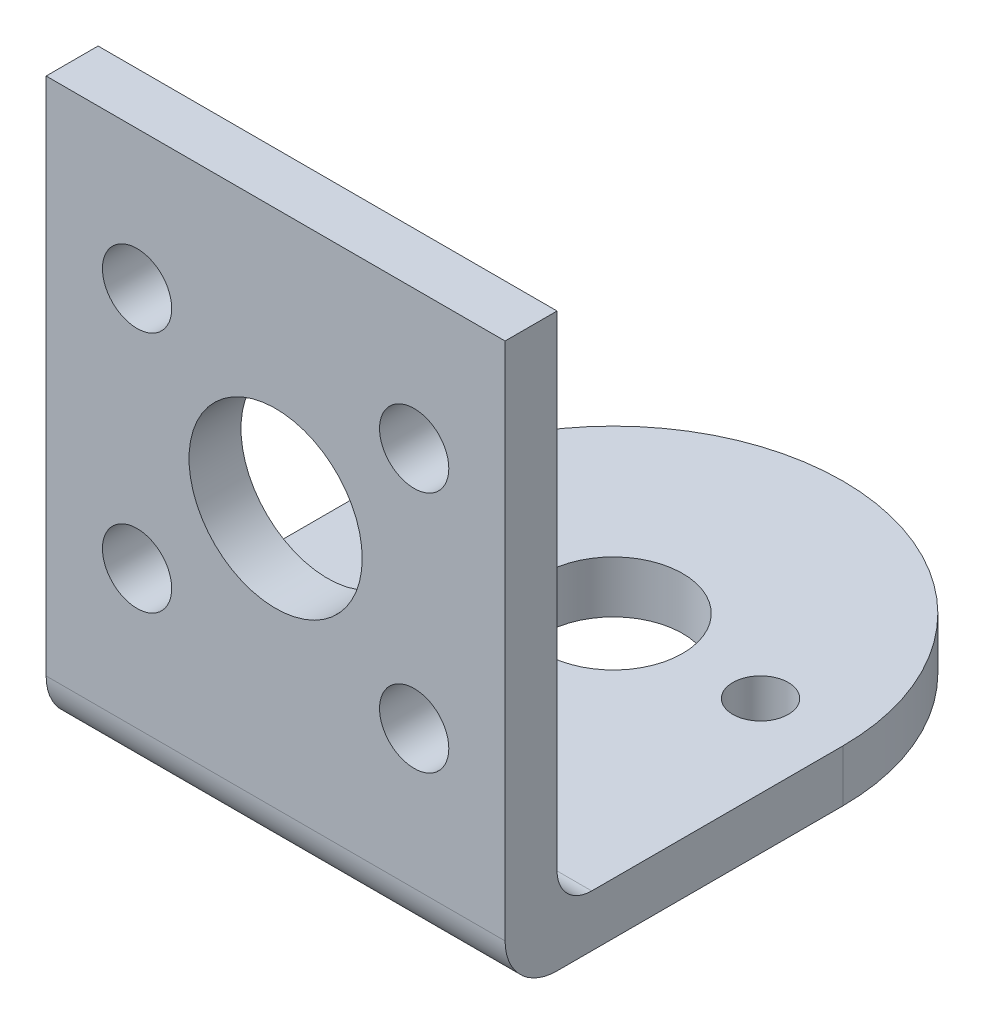
ISO-10303-21;
HEADER;
FILE_DESCRIPTION(('STEP AP214'),'2;1');
FILE_NAME('part.step','',(''),(''),'','','');
FILE_SCHEMA(('AUTOMOTIVE_DESIGN { 1 0 10303 214 1 1 1 1 }'));
ENDSEC;
DATA;
#1=APPLICATION_CONTEXT('core data for automotive mechanical design processes');
#2=APPLICATION_PROTOCOL_DEFINITION('international standard','automotive_design',2000,#1);
#3=PRODUCT_CONTEXT('',#1,'mechanical');
#4=PRODUCT('Part','Part','',(#3));
#5=PRODUCT_RELATED_PRODUCT_CATEGORY('part','',(#4));
#6=PRODUCT_DEFINITION_FORMATION('','',#4);
#7=PRODUCT_DEFINITION_CONTEXT('part definition',#1,'design');
#8=PRODUCT_DEFINITION('design','',#6,#7);
#9=PRODUCT_DEFINITION_SHAPE('','',#8);
#10=(LENGTH_UNIT() NAMED_UNIT(*) SI_UNIT(.MILLI.,.METRE.));
#11=(NAMED_UNIT(*) PLANE_ANGLE_UNIT() SI_UNIT($,.RADIAN.));
#12=(NAMED_UNIT(*) SI_UNIT($,.STERADIAN.) SOLID_ANGLE_UNIT());
#13=UNCERTAINTY_MEASURE_WITH_UNIT(LENGTH_MEASURE(1.E-05),#10,'distance_accuracy_value','');
#14=(GEOMETRIC_REPRESENTATION_CONTEXT(3) GLOBAL_UNCERTAINTY_ASSIGNED_CONTEXT((#13)) GLOBAL_UNIT_ASSIGNED_CONTEXT((#10,
#11,#12)) REPRESENTATION_CONTEXT('',''));
#15=CARTESIAN_POINT('',(0.,0.,0.));
#16=DIRECTION('',(0.,0.,1.));
#17=DIRECTION('',(1.,0.,0.));
#18=AXIS2_PLACEMENT_3D('',#15,#16,#17);
#19=CARTESIAN_POINT('',(0.,0.,0.));
#20=DIRECTION('',(0.,0.,1.));
#21=DIRECTION('',(1.,0.,0.));
#22=AXIS2_PLACEMENT_3D('',#19,#20,#21);
#23=PLANE('',#22);
#24=CARTESIAN_POINT('',(8.,8.5,0.));
#25=DIRECTION('',(0.,0.,1.));
#26=DIRECTION('',(-1.,0.,0.));
#27=AXIS2_PLACEMENT_3D('',#24,#25,#26);
#28=CIRCLE('',#27,2.);
#29=CARTESIAN_POINT('',(10.,8.5,0.));
#30=VERTEX_POINT('',#29);
#31=EDGE_CURVE('E26',#30,#30,#28,.T.);
#32=ORIENTED_EDGE('',*,*,#31,.T.);
#33=EDGE_LOOP('',(#32));
#34=FACE_BOUND('',#33,.T.);
#35=CARTESIAN_POINT('',(-8.,8.5,0.));
#36=DIRECTION('',(0.,0.,1.));
#37=DIRECTION('',(-1.,0.,0.));
#38=AXIS2_PLACEMENT_3D('',#35,#36,#37);
#39=CIRCLE('',#38,2.);
#40=CARTESIAN_POINT('',(-6.,8.5,0.));
#41=VERTEX_POINT('',#40);
#42=EDGE_CURVE('E187',#41,#41,#39,.T.);
#43=ORIENTED_EDGE('',*,*,#42,.T.);
#44=EDGE_LOOP('',(#43));
#45=FACE_BOUND('',#44,.T.);
#46=CARTESIAN_POINT('',(-8.,-5.5,0.));
#47=DIRECTION('',(0.,0.,1.));
#48=DIRECTION('',(-1.,0.,0.));
#49=AXIS2_PLACEMENT_3D('',#46,#47,#48);
#50=CIRCLE('',#49,2.);
#51=CARTESIAN_POINT('',(-6.,-5.5,0.));
#52=VERTEX_POINT('',#51);
#53=EDGE_CURVE('E189',#52,#52,#50,.T.);
#54=ORIENTED_EDGE('',*,*,#53,.T.);
#55=EDGE_LOOP('',(#54));
#56=FACE_BOUND('',#55,.T.);
#57=CARTESIAN_POINT('',(8.,-5.5,0.));
#58=DIRECTION('',(0.,0.,1.));
#59=DIRECTION('',(-1.,0.,0.));
#60=AXIS2_PLACEMENT_3D('',#57,#58,#59);
#61=CIRCLE('',#60,2.);
#62=CARTESIAN_POINT('',(10.,-5.5,0.));
#63=VERTEX_POINT('',#62);
#64=EDGE_CURVE('E237',#63,#63,#61,.T.);
#65=ORIENTED_EDGE('',*,*,#64,.T.);
#66=EDGE_LOOP('',(#65));
#67=FACE_BOUND('',#66,.T.);
#68=CARTESIAN_POINT('',(0.,1.5,0.));
#69=DIRECTION('',(0.,0.,1.));
#70=DIRECTION('',(-1.,0.,0.));
#71=AXIS2_PLACEMENT_3D('',#68,#69,#70);
#72=CIRCLE('',#71,5.);
#73=CARTESIAN_POINT('',(5.,1.5,0.));
#74=VERTEX_POINT('',#73);
#75=EDGE_CURVE('E127',#74,#74,#72,.T.);
#76=ORIENTED_EDGE('',*,*,#75,.T.);
#77=EDGE_LOOP('',(#76));
#78=FACE_BOUND('',#77,.T.);
#79=DIRECTION('',(1.,0.,0.));
#80=VECTOR('',#79,1.);
#81=CARTESIAN_POINT('',(0.,-11.5,0.));
#82=LINE('',#81,#80);
#83=CARTESIAN_POINT('',(-13.25,-11.5,0.));
#84=VERTEX_POINT('',#83);
#85=CARTESIAN_POINT('',(13.25,-11.5,0.));
#86=VERTEX_POINT('',#85);
#87=EDGE_CURVE('E174',#84,#86,#82,.T.);
#88=ORIENTED_EDGE('',*,*,#87,.F.);
#89=DIRECTION('',(0.,-1.,0.));
#90=VECTOR('',#89,1.);
#91=CARTESIAN_POINT('',(-13.25,16.5,0.));
#92=LINE('',#91,#90);
#93=CARTESIAN_POINT('',(-13.25,16.5,0.));
#94=VERTEX_POINT('',#93);
#95=EDGE_CURVE('E157',#94,#84,#92,.T.);
#96=ORIENTED_EDGE('',*,*,#95,.F.);
#97=DIRECTION('',(-1.,0.,0.));
#98=VECTOR('',#97,1.);
#99=CARTESIAN_POINT('',(13.25,16.5,0.));
#100=LINE('',#99,#98);
#101=CARTESIAN_POINT('',(13.25,16.5,0.));
#102=VERTEX_POINT('',#101);
#103=EDGE_CURVE('E10',#102,#94,#100,.T.);
#104=ORIENTED_EDGE('',*,*,#103,.F.);
#105=DIRECTION('',(0.,1.,0.));
#106=VECTOR('',#105,1.);
#107=CARTESIAN_POINT('',(13.25,-16.5,0.));
#108=LINE('',#107,#106);
#109=EDGE_CURVE('E124',#86,#102,#108,.T.);
#110=ORIENTED_EDGE('',*,*,#109,.F.);
#111=EDGE_LOOP('',(#88,#96,#104,#110));
#112=FACE_BOUND('',#111,.T.);
#113=ADVANCED_FACE('F15',(#34,#45,#56,#67,#78,#112),#23,.F.);
#114=CARTESIAN_POINT('',(-13.25,-16.5,0.));
#115=DIRECTION('',(0.,-1.,0.));
#116=DIRECTION('',(1.,0.,0.));
#117=AXIS2_PLACEMENT_3D('',#114,#115,#116);
#118=PLANE('',#117);
#119=CARTESIAN_POINT('',(0.,-16.5,-16.5));
#120=DIRECTION('',(0.,1.,0.));
#121=DIRECTION('',(-1.,0.,0.));
#122=AXIS2_PLACEMENT_3D('',#119,#120,#121);
#123=CIRCLE('',#122,4.);
#124=CARTESIAN_POINT('',(4.,-16.5,-16.5));
#125=VERTEX_POINT('',#124);
#126=EDGE_CURVE('E221',#125,#125,#123,.T.);
#127=ORIENTED_EDGE('',*,*,#126,.T.);
#128=EDGE_LOOP('',(#127));
#129=FACE_BOUND('',#128,.T.);
#130=CARTESIAN_POINT('',(8.5,-16.5,-16.5));
#131=DIRECTION('',(0.,1.,0.));
#132=DIRECTION('',(-1.,0.,0.));
#133=AXIS2_PLACEMENT_3D('',#130,#131,#132);
#134=CIRCLE('',#133,1.6);
#135=CARTESIAN_POINT('',(10.1,-16.5,-16.5));
#136=VERTEX_POINT('',#135);
#137=EDGE_CURVE('E227',#136,#136,#134,.T.);
#138=ORIENTED_EDGE('',*,*,#137,.T.);
#139=EDGE_LOOP('',(#138));
#140=FACE_BOUND('',#139,.T.);
#141=CARTESIAN_POINT('',(-8.5,-16.5,-16.5));
#142=DIRECTION('',(0.,1.,0.));
#143=DIRECTION('',(-1.,0.,0.));
#144=AXIS2_PLACEMENT_3D('',#141,#142,#143);
#145=CIRCLE('',#144,1.6);
#146=CARTESIAN_POINT('',(-6.9,-16.5,-16.5));
#147=VERTEX_POINT('',#146);
#148=EDGE_CURVE('E137',#147,#147,#145,.T.);
#149=ORIENTED_EDGE('',*,*,#148,.T.);
#150=EDGE_LOOP('',(#149));
#151=FACE_BOUND('',#150,.T.);
#152=DIRECTION('',(1.,0.,0.));
#153=VECTOR('',#152,1.);
#154=CARTESIAN_POINT('',(-6.625,-16.5,0.));
#155=LINE('',#154,#153);
#156=CARTESIAN_POINT('',(-13.25,-16.5,0.));
#157=VERTEX_POINT('',#156);
#158=CARTESIAN_POINT('',(13.25,-16.5,0.));
#159=VERTEX_POINT('',#158);
#160=EDGE_CURVE('E201',#157,#159,#155,.T.);
#161=ORIENTED_EDGE('',*,*,#160,.F.);
#162=DIRECTION('',(0.,0.,1.));
#163=VECTOR('',#162,1.);
#164=CARTESIAN_POINT('',(-13.25,-16.5,0.));
#165=LINE('',#164,#163);
#166=CARTESIAN_POINT('',(-13.25,-16.5,-16.5));
#167=VERTEX_POINT('',#166);
#168=EDGE_CURVE('E156',#167,#157,#165,.T.);
#169=ORIENTED_EDGE('',*,*,#168,.F.);
#170=CARTESIAN_POINT('',(0.,-16.5,-16.5));
#171=DIRECTION('',(0.,-1.,0.));
#172=DIRECTION('',(-1.,0.,0.));
#173=AXIS2_PLACEMENT_3D('',#170,#171,#172);
#174=CIRCLE('',#173,13.25);
#175=CARTESIAN_POINT('',(13.25,-16.5,-16.5));
#176=VERTEX_POINT('',#175);
#177=EDGE_CURVE('E215',#167,#176,#174,.T.);
#178=ORIENTED_EDGE('',*,*,#177,.T.);
#179=DIRECTION('',(0.,0.,1.));
#180=VECTOR('',#179,1.);
#181=CARTESIAN_POINT('',(13.25,-16.5,0.));
#182=LINE('',#181,#180);
#183=EDGE_CURVE('E196',#176,#159,#182,.T.);
#184=ORIENTED_EDGE('',*,*,#183,.T.);
#185=EDGE_LOOP('',(#161,#169,#178,#184));
#186=FACE_BOUND('',#185,.T.);
#187=ADVANCED_FACE('F219',(#129,#140,#151,#186),#118,.T.);
#188=CARTESIAN_POINT('',(13.25,16.5,0.));
#189=DIRECTION('',(0.,1.,0.));
#190=DIRECTION('',(-1.,0.,0.));
#191=AXIS2_PLACEMENT_3D('',#188,#189,#190);
#192=PLANE('',#191);
#193=ORIENTED_EDGE('',*,*,#103,.T.);
#194=DIRECTION('',(0.,0.,1.));
#195=VECTOR('',#194,1.);
#196=CARTESIAN_POINT('',(-13.25,16.5,0.));
#197=LINE('',#196,#195);
#198=CARTESIAN_POINT('',(-13.25,16.5,3.));
#199=VERTEX_POINT('',#198);
#200=EDGE_CURVE('E133',#94,#199,#197,.T.);
#201=ORIENTED_EDGE('',*,*,#200,.T.);
#202=DIRECTION('',(-1.,0.,0.));
#203=VECTOR('',#202,1.);
#204=CARTESIAN_POINT('',(13.25,16.5,3.));
#205=LINE('',#204,#203);
#206=CARTESIAN_POINT('',(13.25,16.5,3.));
#207=VERTEX_POINT('',#206);
#208=EDGE_CURVE('E130',#207,#199,#205,.T.);
#209=ORIENTED_EDGE('',*,*,#208,.F.);
#210=DIRECTION('',(0.,0.,1.));
#211=VECTOR('',#210,1.);
#212=CARTESIAN_POINT('',(13.25,16.5,0.));
#213=LINE('',#212,#211);
#214=EDGE_CURVE('E116',#102,#207,#213,.T.);
#215=ORIENTED_EDGE('',*,*,#214,.F.);
#216=EDGE_LOOP('',(#193,#201,#209,#215));
#217=FACE_BOUND('',#216,.T.);
#218=ADVANCED_FACE('F131',(#217),#192,.T.);
#219=CARTESIAN_POINT('',(8.,8.5,0.));
#220=DIRECTION('',(0.,0.,-1.));
#221=DIRECTION('',(-1.,0.,0.));
#222=AXIS2_PLACEMENT_3D('',#219,#220,#221);
#223=CYLINDRICAL_SURFACE('',#222,2.);
#224=ORIENTED_EDGE('',*,*,#31,.F.);
#225=EDGE_LOOP('',(#224));
#226=FACE_BOUND('',#225,.T.);
#227=CARTESIAN_POINT('',(8.,8.5,3.));
#228=DIRECTION('',(0.,0.,-1.));
#229=DIRECTION('',(-1.,0.,0.));
#230=AXIS2_PLACEMENT_3D('',#227,#228,#229);
#231=CIRCLE('',#230,2.);
#232=CARTESIAN_POINT('',(10.,8.5,3.));
#233=VERTEX_POINT('',#232);
#234=EDGE_CURVE('E144',#233,#233,#231,.T.);
#235=ORIENTED_EDGE('',*,*,#234,.F.);
#236=EDGE_LOOP('',(#235));
#237=FACE_BOUND('',#236,.T.);
#238=ADVANCED_FACE('F282',(#226,#237),#223,.F.);
#239=CARTESIAN_POINT('',(-8.,8.5,0.));
#240=DIRECTION('',(0.,0.,-1.));
#241=DIRECTION('',(-1.,0.,0.));
#242=AXIS2_PLACEMENT_3D('',#239,#240,#241);
#243=CYLINDRICAL_SURFACE('',#242,2.);
#244=ORIENTED_EDGE('',*,*,#42,.F.);
#245=EDGE_LOOP('',(#244));
#246=FACE_BOUND('',#245,.T.);
#247=CARTESIAN_POINT('',(-8.,8.5,3.));
#248=DIRECTION('',(0.,0.,-1.));
#249=DIRECTION('',(-1.,0.,0.));
#250=AXIS2_PLACEMENT_3D('',#247,#248,#249);
#251=CIRCLE('',#250,2.);
#252=CARTESIAN_POINT('',(-6.,8.5,3.));
#253=VERTEX_POINT('',#252);
#254=EDGE_CURVE('E146',#253,#253,#251,.T.);
#255=ORIENTED_EDGE('',*,*,#254,.F.);
#256=EDGE_LOOP('',(#255));
#257=FACE_BOUND('',#256,.T.);
#258=ADVANCED_FACE('F284',(#246,#257),#243,.F.);
#259=CARTESIAN_POINT('',(-8.,-5.5,0.));
#260=DIRECTION('',(0.,0.,-1.));
#261=DIRECTION('',(-1.,0.,0.));
#262=AXIS2_PLACEMENT_3D('',#259,#260,#261);
#263=CYLINDRICAL_SURFACE('',#262,2.);
#264=ORIENTED_EDGE('',*,*,#53,.F.);
#265=EDGE_LOOP('',(#264));
#266=FACE_BOUND('',#265,.T.);
#267=CARTESIAN_POINT('',(-8.,-5.5,3.));
#268=DIRECTION('',(0.,0.,-1.));
#269=DIRECTION('',(-1.,0.,0.));
#270=AXIS2_PLACEMENT_3D('',#267,#268,#269);
#271=CIRCLE('',#270,2.);
#272=CARTESIAN_POINT('',(-6.,-5.5,3.));
#273=VERTEX_POINT('',#272);
#274=EDGE_CURVE('E19',#273,#273,#271,.T.);
#275=ORIENTED_EDGE('',*,*,#274,.F.);
#276=EDGE_LOOP('',(#275));
#277=FACE_BOUND('',#276,.T.);
#278=ADVANCED_FACE('F290',(#266,#277),#263,.F.);
#279=CARTESIAN_POINT('',(8.,-5.5,0.));
#280=DIRECTION('',(0.,0.,-1.));
#281=DIRECTION('',(-1.,0.,0.));
#282=AXIS2_PLACEMENT_3D('',#279,#280,#281);
#283=CYLINDRICAL_SURFACE('',#282,2.);
#284=ORIENTED_EDGE('',*,*,#64,.F.);
#285=EDGE_LOOP('',(#284));
#286=FACE_BOUND('',#285,.T.);
#287=CARTESIAN_POINT('',(8.,-5.5,3.));
#288=DIRECTION('',(0.,0.,-1.));
#289=DIRECTION('',(-1.,0.,0.));
#290=AXIS2_PLACEMENT_3D('',#287,#288,#289);
#291=CIRCLE('',#290,2.);
#292=CARTESIAN_POINT('',(10.,-5.5,3.));
#293=VERTEX_POINT('',#292);
#294=EDGE_CURVE('E165',#293,#293,#291,.T.);
#295=ORIENTED_EDGE('',*,*,#294,.F.);
#296=EDGE_LOOP('',(#295));
#297=FACE_BOUND('',#296,.T.);
#298=ADVANCED_FACE('F305',(#286,#297),#283,.F.);
#299=CARTESIAN_POINT('',(0.,1.5,0.));
#300=DIRECTION('',(0.,0.,-1.));
#301=DIRECTION('',(-1.,0.,0.));
#302=AXIS2_PLACEMENT_3D('',#299,#300,#301);
#303=CYLINDRICAL_SURFACE('',#302,5.);
#304=ORIENTED_EDGE('',*,*,#75,.F.);
#305=EDGE_LOOP('',(#304));
#306=FACE_BOUND('',#305,.T.);
#307=CARTESIAN_POINT('',(0.,1.5,3.));
#308=DIRECTION('',(0.,0.,-1.));
#309=DIRECTION('',(-1.,0.,0.));
#310=AXIS2_PLACEMENT_3D('',#307,#308,#309);
#311=CIRCLE('',#310,5.);
#312=CARTESIAN_POINT('',(5.,1.5,3.));
#313=VERTEX_POINT('',#312);
#314=EDGE_CURVE('E159',#313,#313,#311,.T.);
#315=ORIENTED_EDGE('',*,*,#314,.F.);
#316=EDGE_LOOP('',(#315));
#317=FACE_BOUND('',#316,.T.);
#318=ADVANCED_FACE('F307',(#306,#317),#303,.F.);
#319=CARTESIAN_POINT('',(13.25,-16.5,0.));
#320=DIRECTION('',(1.,0.,0.));
#321=DIRECTION('',(0.,1.,0.));
#322=AXIS2_PLACEMENT_3D('',#319,#320,#321);
#323=PLANE('',#322);
#324=CARTESIAN_POINT('',(13.25,-13.5,0.));
#325=DIRECTION('',(-1.,0.,0.));
#326=DIRECTION('',(0.,-0.707106781186547,0.707106781186548));
#327=AXIS2_PLACEMENT_3D('',#324,#325,#326);
#328=CIRCLE('',#327,3.);
#329=CARTESIAN_POINT('',(13.25,-13.5,3.));
#330=VERTEX_POINT('',#329);
#331=EDGE_CURVE('E150',#159,#330,#328,.T.);
#332=ORIENTED_EDGE('',*,*,#331,.F.);
#333=ORIENTED_EDGE('',*,*,#183,.F.);
#334=DIRECTION('',(0.,1.,0.));
#335=VECTOR('',#334,1.);
#336=CARTESIAN_POINT('',(13.25,-16.5,-16.5));
#337=LINE('',#336,#335);
#338=CARTESIAN_POINT('',(13.25,-13.5,-16.5));
#339=VERTEX_POINT('',#338);
#340=EDGE_CURVE('E208',#176,#339,#337,.T.);
#341=ORIENTED_EDGE('',*,*,#340,.T.);
#342=DIRECTION('',(0.,0.,-1.));
#343=VECTOR('',#342,1.);
#344=CARTESIAN_POINT('',(13.25,-13.5,-16.5));
#345=LINE('',#344,#343);
#346=CARTESIAN_POINT('',(13.25,-13.5,-2.));
#347=VERTEX_POINT('',#346);
#348=EDGE_CURVE('E177',#347,#339,#345,.T.);
#349=ORIENTED_EDGE('',*,*,#348,.F.);
#350=CARTESIAN_POINT('',(13.25,-11.5,-2.));
#351=DIRECTION('',(1.,0.,0.));
#352=DIRECTION('',(0.,-0.707106781186548,0.707106781186547));
#353=AXIS2_PLACEMENT_3D('',#350,#351,#352);
#354=CIRCLE('',#353,2.);
#355=EDGE_CURVE('E239',#86,#347,#354,.T.);
#356=ORIENTED_EDGE('',*,*,#355,.F.);
#357=ORIENTED_EDGE('',*,*,#109,.T.);
#358=ORIENTED_EDGE('',*,*,#214,.T.);
#359=DIRECTION('',(0.,1.,0.));
#360=VECTOR('',#359,1.);
#361=CARTESIAN_POINT('',(13.25,-16.5,3.));
#362=LINE('',#361,#360);
#363=EDGE_CURVE('E121',#330,#207,#362,.T.);
#364=ORIENTED_EDGE('',*,*,#363,.F.);
#365=EDGE_LOOP('',(#332,#333,#341,#349,#356,#357,#358,#364));
#366=FACE_BOUND('',#365,.T.);
#367=ADVANCED_FACE('F119',(#366),#323,.T.);
#368=CARTESIAN_POINT('',(0.,-16.5,-16.5));
#369=DIRECTION('',(0.,-1.,0.));
#370=DIRECTION('',(-1.,0.,0.));
#371=AXIS2_PLACEMENT_3D('',#368,#369,#370);
#372=CYLINDRICAL_SURFACE('',#371,13.25);
#373=ORIENTED_EDGE('',*,*,#177,.F.);
#374=DIRECTION('',(0.,1.,0.));
#375=VECTOR('',#374,1.);
#376=CARTESIAN_POINT('',(-13.25,-16.5,-16.5));
#377=LINE('',#376,#375);
#378=CARTESIAN_POINT('',(-13.25,-13.5,-16.5));
#379=VERTEX_POINT('',#378);
#380=EDGE_CURVE('E154',#167,#379,#377,.T.);
#381=ORIENTED_EDGE('',*,*,#380,.T.);
#382=CARTESIAN_POINT('',(0.,-13.5,-16.5));
#383=DIRECTION('',(0.,1.,0.));
#384=DIRECTION('',(-1.,0.,0.));
#385=AXIS2_PLACEMENT_3D('',#382,#383,#384);
#386=CIRCLE('',#385,13.25);
#387=EDGE_CURVE('E183',#339,#379,#386,.T.);
#388=ORIENTED_EDGE('',*,*,#387,.F.);
#389=ORIENTED_EDGE('',*,*,#340,.F.);
#390=EDGE_LOOP('',(#373,#381,#388,#389));
#391=FACE_BOUND('',#390,.T.);
#392=ADVANCED_FACE('F214',(#391),#372,.T.);
#393=CARTESIAN_POINT('',(0.,-16.5,-16.5));
#394=DIRECTION('',(0.,-1.,0.));
#395=DIRECTION('',(-1.,0.,0.));
#396=AXIS2_PLACEMENT_3D('',#393,#394,#395);
#397=CYLINDRICAL_SURFACE('',#396,4.);
#398=ORIENTED_EDGE('',*,*,#126,.F.);
#399=EDGE_LOOP('',(#398));
#400=FACE_BOUND('',#399,.T.);
#401=CARTESIAN_POINT('',(0.,-13.5,-16.5));
#402=DIRECTION('',(0.,-1.,0.));
#403=DIRECTION('',(-1.,0.,0.));
#404=AXIS2_PLACEMENT_3D('',#401,#402,#403);
#405=CIRCLE('',#404,4.);
#406=CARTESIAN_POINT('',(4.,-13.5,-16.5));
#407=VERTEX_POINT('',#406);
#408=EDGE_CURVE('E182',#407,#407,#405,.T.);
#409=ORIENTED_EDGE('',*,*,#408,.F.);
#410=EDGE_LOOP('',(#409));
#411=FACE_BOUND('',#410,.T.);
#412=ADVANCED_FACE('F256',(#400,#411),#397,.F.);
#413=CARTESIAN_POINT('',(8.5,-16.5,-16.5));
#414=DIRECTION('',(0.,-1.,0.));
#415=DIRECTION('',(-1.,0.,0.));
#416=AXIS2_PLACEMENT_3D('',#413,#414,#415);
#417=CYLINDRICAL_SURFACE('',#416,1.6);
#418=ORIENTED_EDGE('',*,*,#137,.F.);
#419=EDGE_LOOP('',(#418));
#420=FACE_BOUND('',#419,.T.);
#421=CARTESIAN_POINT('',(8.5,-13.5,-16.5));
#422=DIRECTION('',(0.,-1.,0.));
#423=DIRECTION('',(-1.,0.,0.));
#424=AXIS2_PLACEMENT_3D('',#421,#422,#423);
#425=CIRCLE('',#424,1.6);
#426=CARTESIAN_POINT('',(10.1,-13.5,-16.5));
#427=VERTEX_POINT('',#426);
#428=EDGE_CURVE('E190',#427,#427,#425,.T.);
#429=ORIENTED_EDGE('',*,*,#428,.F.);
#430=EDGE_LOOP('',(#429));
#431=FACE_BOUND('',#430,.T.);
#432=ADVANCED_FACE('F258',(#420,#431),#417,.F.);
#433=CARTESIAN_POINT('',(-8.5,-16.5,-16.5));
#434=DIRECTION('',(0.,-1.,0.));
#435=DIRECTION('',(-1.,0.,0.));
#436=AXIS2_PLACEMENT_3D('',#433,#434,#435);
#437=CYLINDRICAL_SURFACE('',#436,1.6);
#438=ORIENTED_EDGE('',*,*,#148,.F.);
#439=EDGE_LOOP('',(#438));
#440=FACE_BOUND('',#439,.T.);
#441=CARTESIAN_POINT('',(-8.5,-13.5,-16.5));
#442=DIRECTION('',(0.,-1.,0.));
#443=DIRECTION('',(-1.,0.,0.));
#444=AXIS2_PLACEMENT_3D('',#441,#442,#443);
#445=CIRCLE('',#444,1.6);
#446=CARTESIAN_POINT('',(-6.9,-13.5,-16.5));
#447=VERTEX_POINT('',#446);
#448=EDGE_CURVE('E193',#447,#447,#445,.T.);
#449=ORIENTED_EDGE('',*,*,#448,.F.);
#450=EDGE_LOOP('',(#449));
#451=FACE_BOUND('',#450,.T.);
#452=ADVANCED_FACE('F266',(#440,#451),#437,.F.);
#453=CARTESIAN_POINT('',(0.,0.,3.));
#454=DIRECTION('',(0.,0.,1.));
#455=DIRECTION('',(1.,0.,0.));
#456=AXIS2_PLACEMENT_3D('',#453,#454,#455);
#457=PLANE('',#456);
#458=DIRECTION('',(-1.,0.,0.));
#459=VECTOR('',#458,1.);
#460=CARTESIAN_POINT('',(-6.625,-13.5,3.));
#461=LINE('',#460,#459);
#462=CARTESIAN_POINT('',(-13.25,-13.5,3.));
#463=VERTEX_POINT('',#462);
#464=EDGE_CURVE('E142',#330,#463,#461,.T.);
#465=ORIENTED_EDGE('',*,*,#464,.F.);
#466=ORIENTED_EDGE('',*,*,#363,.T.);
#467=ORIENTED_EDGE('',*,*,#208,.T.);
#468=DIRECTION('',(0.,-1.,0.));
#469=VECTOR('',#468,1.);
#470=CARTESIAN_POINT('',(-13.25,16.5,3.));
#471=LINE('',#470,#469);
#472=EDGE_CURVE('E198',#199,#463,#471,.T.);
#473=ORIENTED_EDGE('',*,*,#472,.T.);
#474=EDGE_LOOP('',(#465,#466,#467,#473));
#475=FACE_BOUND('',#474,.T.);
#476=ORIENTED_EDGE('',*,*,#234,.T.);
#477=EDGE_LOOP('',(#476));
#478=FACE_BOUND('',#477,.T.);
#479=ORIENTED_EDGE('',*,*,#254,.T.);
#480=EDGE_LOOP('',(#479));
#481=FACE_BOUND('',#480,.T.);
#482=ORIENTED_EDGE('',*,*,#274,.T.);
#483=EDGE_LOOP('',(#482));
#484=FACE_BOUND('',#483,.T.);
#485=ORIENTED_EDGE('',*,*,#294,.T.);
#486=EDGE_LOOP('',(#485));
#487=FACE_BOUND('',#486,.T.);
#488=ORIENTED_EDGE('',*,*,#314,.T.);
#489=EDGE_LOOP('',(#488));
#490=FACE_BOUND('',#489,.T.);
#491=ADVANCED_FACE('F139',(#475,#478,#481,#484,#487,#490),#457,.T.);
#492=CARTESIAN_POINT('',(-13.25,16.5,0.));
#493=DIRECTION('',(-1.,0.,0.));
#494=DIRECTION('',(0.,-1.,0.));
#495=AXIS2_PLACEMENT_3D('',#492,#493,#494);
#496=PLANE('',#495);
#497=CARTESIAN_POINT('',(-13.25,-13.5,0.));
#498=DIRECTION('',(1.,0.,0.));
#499=DIRECTION('',(0.,-0.707106781186547,0.707106781186548));
#500=AXIS2_PLACEMENT_3D('',#497,#498,#499);
#501=CIRCLE('',#500,3.);
#502=EDGE_CURVE('E152',#463,#157,#501,.T.);
#503=ORIENTED_EDGE('',*,*,#502,.F.);
#504=ORIENTED_EDGE('',*,*,#472,.F.);
#505=ORIENTED_EDGE('',*,*,#200,.F.);
#506=ORIENTED_EDGE('',*,*,#95,.T.);
#507=CARTESIAN_POINT('',(-13.25,-11.5,-2.));
#508=DIRECTION('',(-1.,0.,0.));
#509=DIRECTION('',(0.,-0.707106781186548,0.707106781186547));
#510=AXIS2_PLACEMENT_3D('',#507,#508,#509);
#511=CIRCLE('',#510,2.);
#512=CARTESIAN_POINT('',(-13.25,-13.5,-2.));
#513=VERTEX_POINT('',#512);
#514=EDGE_CURVE('E178',#513,#84,#511,.T.);
#515=ORIENTED_EDGE('',*,*,#514,.F.);
#516=DIRECTION('',(0.,0.,1.));
#517=VECTOR('',#516,1.);
#518=CARTESIAN_POINT('',(-13.25,-13.5,3.));
#519=LINE('',#518,#517);
#520=EDGE_CURVE('E179',#379,#513,#519,.T.);
#521=ORIENTED_EDGE('',*,*,#520,.F.);
#522=ORIENTED_EDGE('',*,*,#380,.F.);
#523=ORIENTED_EDGE('',*,*,#168,.T.);
#524=EDGE_LOOP('',(#503,#504,#505,#506,#515,#521,#522,#523));
#525=FACE_BOUND('',#524,.T.);
#526=ADVANCED_FACE('F298',(#525),#496,.T.);
#527=CARTESIAN_POINT('',(-6.625,-13.5,0.));
#528=DIRECTION('',(-1.,0.,0.));
#529=DIRECTION('',(0.,-0.707106781186547,0.707106781186548));
#530=AXIS2_PLACEMENT_3D('',#527,#528,#529);
#531=CYLINDRICAL_SURFACE('',#530,3.);
#532=ORIENTED_EDGE('',*,*,#331,.T.);
#533=ORIENTED_EDGE('',*,*,#464,.T.);
#534=ORIENTED_EDGE('',*,*,#502,.T.);
#535=ORIENTED_EDGE('',*,*,#160,.T.);
#536=EDGE_LOOP('',(#532,#533,#534,#535));
#537=FACE_BOUND('',#536,.T.);
#538=ADVANCED_FACE('F206',(#537),#531,.T.);
#539=CARTESIAN_POINT('',(0.,-13.5,-21.0625063156125));
#540=DIRECTION('',(0.,-1.,0.));
#541=DIRECTION('',(0.,0.,-1.));
#542=AXIS2_PLACEMENT_3D('',#539,#540,#541);
#543=PLANE('',#542);
#544=ORIENTED_EDGE('',*,*,#448,.T.);
#545=EDGE_LOOP('',(#544));
#546=FACE_BOUND('',#545,.T.);
#547=ORIENTED_EDGE('',*,*,#428,.T.);
#548=EDGE_LOOP('',(#547));
#549=FACE_BOUND('',#548,.T.);
#550=ORIENTED_EDGE('',*,*,#408,.T.);
#551=EDGE_LOOP('',(#550));
#552=FACE_BOUND('',#551,.T.);
#553=DIRECTION('',(-1.,0.,0.));
#554=VECTOR('',#553,1.);
#555=CARTESIAN_POINT('',(0.,-13.5,-2.));
#556=LINE('',#555,#554);
#557=EDGE_CURVE('E172',#347,#513,#556,.T.);
#558=ORIENTED_EDGE('',*,*,#557,.F.);
#559=ORIENTED_EDGE('',*,*,#348,.T.);
#560=ORIENTED_EDGE('',*,*,#387,.T.);
#561=ORIENTED_EDGE('',*,*,#520,.T.);
#562=EDGE_LOOP('',(#558,#559,#560,#561));
#563=FACE_BOUND('',#562,.T.);
#564=ADVANCED_FACE('F17',(#546,#549,#552,#563),#543,.F.);
#565=CARTESIAN_POINT('',(0.,-11.5,-2.));
#566=DIRECTION('',(1.,0.,0.));
#567=DIRECTION('',(0.,-0.707106781186548,0.707106781186547));
#568=AXIS2_PLACEMENT_3D('',#565,#566,#567);
#569=CYLINDRICAL_SURFACE('',#568,2.);
#570=ORIENTED_EDGE('',*,*,#355,.T.);
#571=ORIENTED_EDGE('',*,*,#557,.T.);
#572=ORIENTED_EDGE('',*,*,#514,.T.);
#573=ORIENTED_EDGE('',*,*,#87,.T.);
#574=EDGE_LOOP('',(#570,#571,#572,#573));
#575=FACE_BOUND('',#574,.T.);
#576=ADVANCED_FACE('F318',(#575),#569,.F.);
#577=CLOSED_SHELL('',(#113,#187,#218,#238,#258,#278,#298,#318,#367,#392,#412,#432,#452,#491,
#526,#538,#564,#576));
#578=MANIFOLD_SOLID_BREP('B1',#577);
#579=ADVANCED_BREP_SHAPE_REPRESENTATION('',(#18,#578),#14);
#580=SHAPE_DEFINITION_REPRESENTATION(#9,#579);
ENDSEC;
END-ISO-10303-21;
